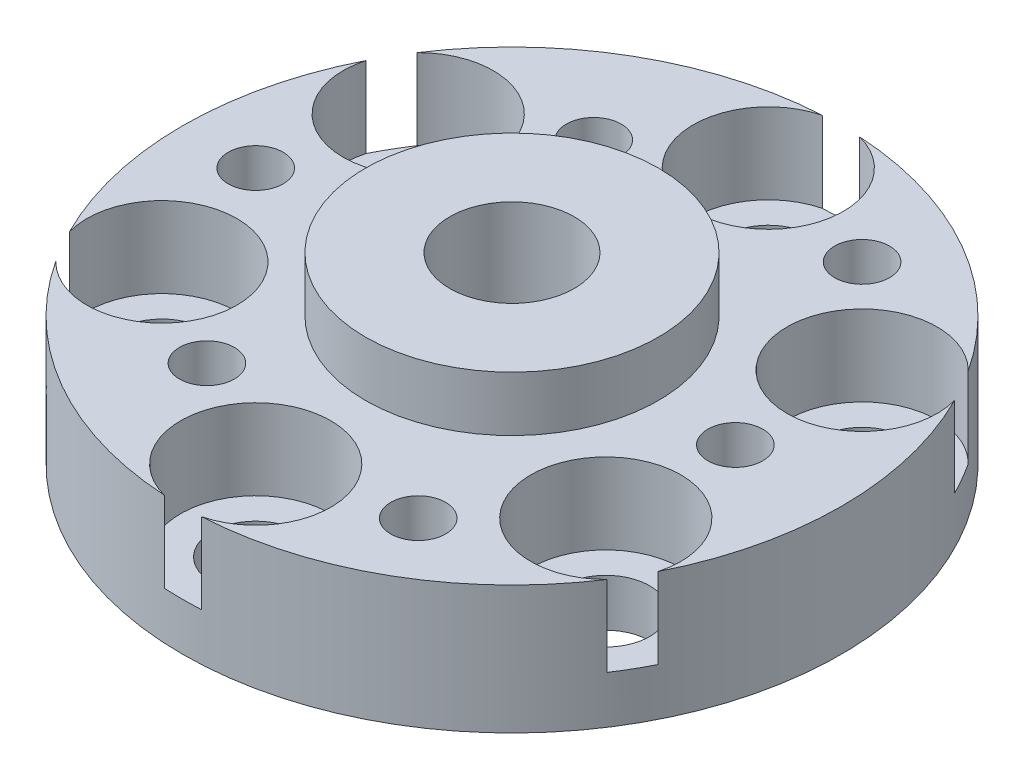
ISO-10303-21;
HEADER;
FILE_DESCRIPTION(('STEP AP214'),'2;1');
FILE_NAME('part.step','',(''),(''),'','','');
FILE_SCHEMA(('AUTOMOTIVE_DESIGN { 1 0 10303 214 1 1 1 1 }'));
ENDSEC;
DATA;
#1=APPLICATION_CONTEXT('core data for automotive mechanical design processes');
#2=APPLICATION_PROTOCOL_DEFINITION('international standard','automotive_design',2000,#1);
#3=PRODUCT_CONTEXT('',#1,'mechanical');
#4=PRODUCT('Part','Part','',(#3));
#5=PRODUCT_RELATED_PRODUCT_CATEGORY('part','',(#4));
#6=PRODUCT_DEFINITION_FORMATION('','',#4);
#7=PRODUCT_DEFINITION_CONTEXT('part definition',#1,'design');
#8=PRODUCT_DEFINITION('design','',#6,#7);
#9=PRODUCT_DEFINITION_SHAPE('','',#8);
#10=(LENGTH_UNIT() NAMED_UNIT(*) SI_UNIT(.MILLI.,.METRE.));
#11=(NAMED_UNIT(*) PLANE_ANGLE_UNIT() SI_UNIT($,.RADIAN.));
#12=(NAMED_UNIT(*) SI_UNIT($,.STERADIAN.) SOLID_ANGLE_UNIT());
#13=UNCERTAINTY_MEASURE_WITH_UNIT(LENGTH_MEASURE(1.E-05),#10,'distance_accuracy_value','');
#14=(GEOMETRIC_REPRESENTATION_CONTEXT(3) GLOBAL_UNCERTAINTY_ASSIGNED_CONTEXT((#13)) GLOBAL_UNIT_ASSIGNED_CONTEXT((#10,
#11,#12)) REPRESENTATION_CONTEXT('',''));
#15=CARTESIAN_POINT('',(0.,0.,0.));
#16=DIRECTION('',(0.,0.,1.));
#17=DIRECTION('',(1.,0.,0.));
#18=AXIS2_PLACEMENT_3D('',#15,#16,#17);
#19=CARTESIAN_POINT('',(0.,7.,0.));
#20=DIRECTION('',(0.,-1.,0.));
#21=DIRECTION('',(0.,0.,-1.));
#22=AXIS2_PLACEMENT_3D('',#19,#20,#21);
#23=CYLINDRICAL_SURFACE('',#22,18.);
#24=CARTESIAN_POINT('',(0.,2.6,0.));
#25=DIRECTION('',(0.,-1.,0.));
#26=DIRECTION('',(0.,0.,-1.));
#27=AXIS2_PLACEMENT_3D('',#24,#25,#26);
#28=CIRCLE('',#27,18.);
#29=CARTESIAN_POINT('',(-1.02009397076136,2.6,-17.9710714285714));
#30=VERTEX_POINT('',#29);
#31=CARTESIAN_POINT('',(1.02009397076136,2.6,-17.9710714285714));
#32=VERTEX_POINT('',#31);
#33=EDGE_CURVE('E11',#30,#32,#28,.T.);
#34=ORIENTED_EDGE('',*,*,#33,.T.);
#35=DIRECTION('',(0.,1.,0.));
#36=VECTOR('',#35,1.);
#37=CARTESIAN_POINT('',(1.02009397076138,4.8,-17.9710714285714));
#38=LINE('',#37,#36);
#39=CARTESIAN_POINT('',(1.02009397076138,7.,-17.9710714285714));
#40=VERTEX_POINT('',#39);
#41=EDGE_CURVE('E133',#32,#40,#38,.T.);
#42=ORIENTED_EDGE('',*,*,#41,.T.);
#43=CARTESIAN_POINT('',(0.,7.,0.));
#44=DIRECTION('',(0.,1.,0.));
#45=DIRECTION('',(0.,0.,1.));
#46=AXIS2_PLACEMENT_3D('',#43,#44,#45);
#47=CIRCLE('',#46,18.);
#48=CARTESIAN_POINT('',(15.0533574049853,7.,-9.86896300721486));
#49=VERTEX_POINT('',#48);
#50=EDGE_CURVE('E399',#49,#40,#47,.T.);
#51=ORIENTED_EDGE('',*,*,#50,.F.);
#52=DIRECTION('',(0.,1.,0.));
#53=VECTOR('',#52,1.);
#54=CARTESIAN_POINT('',(15.0533574049853,4.8,-9.86896300721486));
#55=LINE('',#54,#53);
#56=CARTESIAN_POINT('',(15.0533574049853,2.6,-9.86896300721487));
#57=VERTEX_POINT('',#56);
#58=EDGE_CURVE('E290',#49,#57,#55,.F.);
#59=ORIENTED_EDGE('',*,*,#58,.T.);
#60=CARTESIAN_POINT('',(0.,2.6,0.));
#61=DIRECTION('',(0.,-1.,0.));
#62=DIRECTION('',(0.,0.,-1.));
#63=AXIS2_PLACEMENT_3D('',#60,#61,#62);
#64=CIRCLE('',#63,18.);
#65=CARTESIAN_POINT('',(16.0734513757492,2.6,-8.10210842135708));
#66=VERTEX_POINT('',#65);
#67=EDGE_CURVE('E286',#57,#66,#64,.T.);
#68=ORIENTED_EDGE('',*,*,#67,.T.);
#69=DIRECTION('',(0.,1.,0.));
#70=VECTOR('',#69,1.);
#71=CARTESIAN_POINT('',(16.0734513757492,4.8,-8.10210842135708));
#72=LINE('',#71,#70);
#73=CARTESIAN_POINT('',(16.0734513757492,7.,-8.10210842135708));
#74=VERTEX_POINT('',#73);
#75=EDGE_CURVE('E294',#66,#74,#72,.T.);
#76=ORIENTED_EDGE('',*,*,#75,.T.);
#77=CARTESIAN_POINT('',(16.0734513757499,7.,8.10210842135571));
#78=VERTEX_POINT('',#77);
#79=EDGE_CURVE('E402',#78,#74,#47,.T.);
#80=ORIENTED_EDGE('',*,*,#79,.F.);
#81=DIRECTION('',(0.,1.,0.));
#82=VECTOR('',#81,1.);
#83=CARTESIAN_POINT('',(16.0734513757499,4.8,8.10210842135571));
#84=LINE('',#83,#82);
#85=CARTESIAN_POINT('',(16.0734513757499,2.6,8.10210842135571));
#86=VERTEX_POINT('',#85);
#87=EDGE_CURVE('E178',#78,#86,#84,.F.);
#88=ORIENTED_EDGE('',*,*,#87,.T.);
#89=CARTESIAN_POINT('',(0.,2.6,0.));
#90=DIRECTION('',(0.,-1.,0.));
#91=DIRECTION('',(0.,0.,-1.));
#92=AXIS2_PLACEMENT_3D('',#89,#90,#91);
#93=CIRCLE('',#92,18.);
#94=CARTESIAN_POINT('',(15.0533574049861,2.6,9.86896300721358));
#95=VERTEX_POINT('',#94);
#96=EDGE_CURVE('E282',#86,#95,#93,.T.);
#97=ORIENTED_EDGE('',*,*,#96,.T.);
#98=DIRECTION('',(0.,1.,0.));
#99=VECTOR('',#98,1.);
#100=CARTESIAN_POINT('',(15.0533574049861,4.8,9.86896300721358));
#101=LINE('',#100,#99);
#102=CARTESIAN_POINT('',(15.0533574049861,7.,9.86896300721358));
#103=VERTEX_POINT('',#102);
#104=EDGE_CURVE('E182',#95,#103,#101,.T.);
#105=ORIENTED_EDGE('',*,*,#104,.T.);
#106=CARTESIAN_POINT('',(1.0200939707629,7.,17.9710714285713));
#107=VERTEX_POINT('',#106);
#108=EDGE_CURVE('E406',#107,#103,#47,.T.);
#109=ORIENTED_EDGE('',*,*,#108,.F.);
#110=DIRECTION('',(0.,1.,0.));
#111=VECTOR('',#110,1.);
#112=CARTESIAN_POINT('',(1.0200939707629,4.8,17.9710714285713));
#113=LINE('',#112,#111);
#114=CARTESIAN_POINT('',(1.0200939707629,2.6,17.9710714285713));
#115=VERTEX_POINT('',#114);
#116=EDGE_CURVE('E197',#107,#115,#113,.F.);
#117=ORIENTED_EDGE('',*,*,#116,.T.);
#118=CARTESIAN_POINT('',(0.,2.6,0.));
#119=DIRECTION('',(0.,-1.,0.));
#120=DIRECTION('',(0.,0.,-1.));
#121=AXIS2_PLACEMENT_3D('',#118,#119,#120);
#122=CIRCLE('',#121,18.);
#123=CARTESIAN_POINT('',(-1.02009397075985,2.6,17.9710714285715));
#124=VERTEX_POINT('',#123);
#125=EDGE_CURVE('E269',#115,#124,#122,.T.);
#126=ORIENTED_EDGE('',*,*,#125,.T.);
#127=DIRECTION('',(0.,1.,0.));
#128=VECTOR('',#127,1.);
#129=CARTESIAN_POINT('',(-1.02009397075985,4.8,17.9710714285715));
#130=LINE('',#129,#128);
#131=CARTESIAN_POINT('',(-1.02009397075985,7.,17.9710714285715));
#132=VERTEX_POINT('',#131);
#133=EDGE_CURVE('E201',#124,#132,#130,.T.);
#134=ORIENTED_EDGE('',*,*,#133,.T.);
#135=CARTESIAN_POINT('',(-15.0533574049877,7.,9.86896300721121));
#136=VERTEX_POINT('',#135);
#137=EDGE_CURVE('E249',#136,#132,#47,.T.);
#138=ORIENTED_EDGE('',*,*,#137,.F.);
#139=DIRECTION('',(0.,1.,0.));
#140=VECTOR('',#139,1.);
#141=CARTESIAN_POINT('',(-15.0533574049877,4.8,9.86896300721121));
#142=LINE('',#141,#140);
#143=CARTESIAN_POINT('',(-15.0533574049877,2.6,9.86896300721121));
#144=VERTEX_POINT('',#143);
#145=EDGE_CURVE('E220',#136,#144,#142,.F.);
#146=ORIENTED_EDGE('',*,*,#145,.T.);
#147=CARTESIAN_POINT('',(0.,2.6,0.));
#148=DIRECTION('',(0.,-1.,0.));
#149=DIRECTION('',(0.,0.,-1.));
#150=AXIS2_PLACEMENT_3D('',#147,#148,#149);
#151=CIRCLE('',#150,18.);
#152=CARTESIAN_POINT('',(-16.0734513757466,2.6,8.10210842136235));
#153=VERTEX_POINT('',#152);
#154=EDGE_CURVE('E209',#144,#153,#151,.T.);
#155=ORIENTED_EDGE('',*,*,#154,.T.);
#156=DIRECTION('',(0.,1.,0.));
#157=VECTOR('',#156,1.);
#158=CARTESIAN_POINT('',(-16.0734513757466,4.8,8.10210842136235));
#159=LINE('',#158,#157);
#160=CARTESIAN_POINT('',(-16.0734513757466,7.,8.10210842136235));
#161=VERTEX_POINT('',#160);
#162=EDGE_CURVE('E224',#153,#161,#159,.T.);
#163=ORIENTED_EDGE('',*,*,#162,.T.);
#164=CARTESIAN_POINT('',(-16.0734513757473,7.,-8.10210842136098));
#165=VERTEX_POINT('',#164);
#166=EDGE_CURVE('E244',#165,#161,#47,.T.);
#167=ORIENTED_EDGE('',*,*,#166,.F.);
#168=DIRECTION('',(0.,1.,0.));
#169=VECTOR('',#168,1.);
#170=CARTESIAN_POINT('',(-16.0734513757473,4.8,-8.10210842136098));
#171=LINE('',#170,#169);
#172=CARTESIAN_POINT('',(-16.0734513757473,2.6,-8.10210842136098));
#173=VERTEX_POINT('',#172);
#174=EDGE_CURVE('E236',#165,#173,#171,.F.);
#175=ORIENTED_EDGE('',*,*,#174,.T.);
#176=CARTESIAN_POINT('',(0.,2.6,0.));
#177=DIRECTION('',(0.,-1.,0.));
#178=DIRECTION('',(0.,0.,-1.));
#179=AXIS2_PLACEMENT_3D('',#176,#177,#178);
#180=CIRCLE('',#179,18.);
#181=CARTESIAN_POINT('',(-15.0533574049885,2.6,-9.86896300720993));
#182=VERTEX_POINT('',#181);
#183=EDGE_CURVE('E210',#173,#182,#180,.T.);
#184=ORIENTED_EDGE('',*,*,#183,.T.);
#185=DIRECTION('',(0.,1.,0.));
#186=VECTOR('',#185,1.);
#187=CARTESIAN_POINT('',(-15.0533574049885,4.8,-9.86896300720993));
#188=LINE('',#187,#186);
#189=CARTESIAN_POINT('',(-15.0533574049885,7.,-9.86896300720993));
#190=VERTEX_POINT('',#189);
#191=EDGE_CURVE('E240',#182,#190,#188,.T.);
#192=ORIENTED_EDGE('',*,*,#191,.T.);
#193=CARTESIAN_POINT('',(-1.02009397076138,7.,-17.9710714285714));
#194=VERTEX_POINT('',#193);
#195=EDGE_CURVE('E152',#194,#190,#47,.T.);
#196=ORIENTED_EDGE('',*,*,#195,.F.);
#197=DIRECTION('',(0.,1.,0.));
#198=VECTOR('',#197,1.);
#199=CARTESIAN_POINT('',(-1.02009397076138,4.8,-17.9710714285714));
#200=LINE('',#199,#198);
#201=EDGE_CURVE('E60',#194,#30,#200,.F.);
#202=ORIENTED_EDGE('',*,*,#201,.T.);
#203=EDGE_LOOP('',(#34,#42,#51,#59,#68,#76,#80,#88,#97,#105,#109,#117,#126,#134,#138,#146,#155,
#163,#167,#175,#184,#192,#196,#202));
#204=FACE_BOUND('',#203,.T.);
#205=CARTESIAN_POINT('',(0.,0.,0.));
#206=DIRECTION('',(0.,1.,0.));
#207=DIRECTION('',(0.,0.,1.));
#208=AXIS2_PLACEMENT_3D('',#205,#206,#207);
#209=CIRCLE('',#208,18.);
#210=CARTESIAN_POINT('',(0.,0.,18.));
#211=VERTEX_POINT('',#210);
#212=EDGE_CURVE('E250',#211,#211,#209,.T.);
#213=ORIENTED_EDGE('',*,*,#212,.T.);
#214=EDGE_LOOP('',(#213));
#215=FACE_BOUND('',#214,.T.);
#216=ADVANCED_FACE('F45',(#204,#215),#23,.T.);
#217=CARTESIAN_POINT('',(0.,7.,0.));
#218=DIRECTION('',(0.,1.,0.));
#219=DIRECTION('',(0.,0.,1.));
#220=AXIS2_PLACEMENT_3D('',#217,#218,#219);
#221=PLANE('',#220);
#222=CARTESIAN_POINT('',(0.,7.,0.));
#223=DIRECTION('',(0.,1.,0.));
#224=DIRECTION('',(0.,0.,1.));
#225=AXIS2_PLACEMENT_3D('',#222,#223,#224);
#226=CIRCLE('',#225,8.);
#227=CARTESIAN_POINT('',(0.,7.,8.));
#228=VERTEX_POINT('',#227);
#229=EDGE_CURVE('E550',#228,#228,#226,.T.);
#230=ORIENTED_EDGE('',*,*,#229,.F.);
#231=EDGE_LOOP('',(#230));
#232=FACE_BOUND('',#231,.T.);
#233=CARTESIAN_POINT('',(12.2,7.,0.));
#234=DIRECTION('',(0.,1.,0.));
#235=DIRECTION('',(0.,0.,1.));
#236=AXIS2_PLACEMENT_3D('',#233,#234,#235);
#237=CIRCLE('',#236,1.49999999999999);
#238=CARTESIAN_POINT('',(12.2,7.,1.49999999999999));
#239=VERTEX_POINT('',#238);
#240=EDGE_CURVE('E557',#239,#239,#237,.T.);
#241=ORIENTED_EDGE('',*,*,#240,.F.);
#242=EDGE_LOOP('',(#241));
#243=FACE_BOUND('',#242,.T.);
#244=CARTESIAN_POINT('',(-6.10000000000005,7.,10.5655099261701));
#245=DIRECTION('',(0.,1.,0.));
#246=DIRECTION('',(0.,0.,1.));
#247=AXIS2_PLACEMENT_3D('',#244,#245,#246);
#248=CIRCLE('',#247,1.49999999999999);
#249=CARTESIAN_POINT('',(-6.10000000000005,7.,12.0655099261701));
#250=VERTEX_POINT('',#249);
#251=EDGE_CURVE('E568',#250,#250,#248,.T.);
#252=ORIENTED_EDGE('',*,*,#251,.F.);
#253=EDGE_LOOP('',(#252));
#254=FACE_BOUND('',#253,.T.);
#255=CARTESIAN_POINT('',(-6.0999999999999,7.,-10.5655099261702));
#256=DIRECTION('',(0.,1.,0.));
#257=DIRECTION('',(0.,0.,1.));
#258=AXIS2_PLACEMENT_3D('',#255,#256,#257);
#259=CIRCLE('',#258,1.49999999999999);
#260=CARTESIAN_POINT('',(-6.0999999999999,7.,-9.06550992617022));
#261=VERTEX_POINT('',#260);
#262=EDGE_CURVE('E576',#261,#261,#259,.T.);
#263=ORIENTED_EDGE('',*,*,#262,.F.);
#264=EDGE_LOOP('',(#263));
#265=FACE_BOUND('',#264,.T.);
#266=CARTESIAN_POINT('',(-14.,7.,0.));
#267=DIRECTION('',(0.,1.,0.));
#268=DIRECTION('',(0.,0.,1.));
#269=AXIS2_PLACEMENT_3D('',#266,#267,#268);
#270=CIRCLE('',#269,1.5);
#271=CARTESIAN_POINT('',(-14.,7.,1.5));
#272=VERTEX_POINT('',#271);
#273=EDGE_CURVE('E584',#272,#272,#270,.T.);
#274=ORIENTED_EDGE('',*,*,#273,.F.);
#275=EDGE_LOOP('',(#274));
#276=FACE_BOUND('',#275,.T.);
#277=CARTESIAN_POINT('',(7.00000000000023,7.,-12.124355652982));
#278=DIRECTION('',(0.,1.,0.));
#279=DIRECTION('',(0.,0.,1.));
#280=AXIS2_PLACEMENT_3D('',#277,#278,#279);
#281=CIRCLE('',#280,1.5);
#282=CARTESIAN_POINT('',(7.00000000000023,7.,-10.624355652982));
#283=VERTEX_POINT('',#282);
#284=EDGE_CURVE('E592',#283,#283,#281,.T.);
#285=ORIENTED_EDGE('',*,*,#284,.F.);
#286=EDGE_LOOP('',(#285));
#287=FACE_BOUND('',#286,.T.);
#288=CARTESIAN_POINT('',(7.,7.,12.1243556529821));
#289=DIRECTION('',(0.,1.,0.));
#290=DIRECTION('',(0.,0.,1.));
#291=AXIS2_PLACEMENT_3D('',#288,#289,#290);
#292=CIRCLE('',#291,1.5);
#293=CARTESIAN_POINT('',(7.,7.,13.6243556529821));
#294=VERTEX_POINT('',#293);
#295=EDGE_CURVE('E600',#294,#294,#292,.T.);
#296=ORIENTED_EDGE('',*,*,#295,.F.);
#297=EDGE_LOOP('',(#296));
#298=FACE_BOUND('',#297,.T.);
#299=CARTESIAN_POINT('',(0.,7.,-14.));
#300=DIRECTION('',(0.,1.,0.));
#301=DIRECTION('',(0.,0.,1.));
#302=AXIS2_PLACEMENT_3D('',#299,#300,#301);
#303=CIRCLE('',#302,4.1);
#304=EDGE_CURVE('E53',#194,#40,#303,.T.);
#305=ORIENTED_EDGE('',*,*,#304,.F.);
#306=ORIENTED_EDGE('',*,*,#195,.T.);
#307=CARTESIAN_POINT('',(-12.1243556529818,7.,-6.99999999999949));
#308=DIRECTION('',(0.,1.,0.));
#309=DIRECTION('',(0.,0.,1.));
#310=AXIS2_PLACEMENT_3D('',#307,#308,#309);
#311=CIRCLE('',#310,4.1);
#312=EDGE_CURVE('E248',#165,#190,#311,.T.);
#313=ORIENTED_EDGE('',*,*,#312,.F.);
#314=ORIENTED_EDGE('',*,*,#166,.T.);
#315=CARTESIAN_POINT('',(-12.1243556529812,7.,7.00000000000052));
#316=DIRECTION('',(0.,1.,0.));
#317=DIRECTION('',(0.,0.,1.));
#318=AXIS2_PLACEMENT_3D('',#315,#316,#317);
#319=CIRCLE('',#318,4.1);
#320=EDGE_CURVE('E206',#136,#161,#319,.T.);
#321=ORIENTED_EDGE('',*,*,#320,.F.);
#322=ORIENTED_EDGE('',*,*,#137,.T.);
#323=CARTESIAN_POINT('',(1.18856827952055E-12,7.,14.));
#324=DIRECTION('',(0.,1.,0.));
#325=DIRECTION('',(0.,0.,1.));
#326=AXIS2_PLACEMENT_3D('',#323,#324,#325);
#327=CIRCLE('',#326,4.1);
#328=EDGE_CURVE('E186',#107,#132,#327,.T.);
#329=ORIENTED_EDGE('',*,*,#328,.F.);
#330=ORIENTED_EDGE('',*,*,#108,.T.);
#331=CARTESIAN_POINT('',(12.124355652983,7.,6.99999999999948));
#332=DIRECTION('',(0.,1.,0.));
#333=DIRECTION('',(0.,0.,1.));
#334=AXIS2_PLACEMENT_3D('',#331,#332,#333);
#335=CIRCLE('',#334,4.1);
#336=EDGE_CURVE('E273',#78,#103,#335,.T.);
#337=ORIENTED_EDGE('',*,*,#336,.F.);
#338=ORIENTED_EDGE('',*,*,#79,.T.);
#339=CARTESIAN_POINT('',(12.1243556529824,7.,-7.00000000000052));
#340=DIRECTION('',(0.,1.,0.));
#341=DIRECTION('',(0.,0.,1.));
#342=AXIS2_PLACEMENT_3D('',#339,#340,#341);
#343=CIRCLE('',#342,4.1);
#344=EDGE_CURVE('E159',#49,#74,#343,.T.);
#345=ORIENTED_EDGE('',*,*,#344,.F.);
#346=ORIENTED_EDGE('',*,*,#50,.T.);
#347=EDGE_LOOP('',(#305,#306,#313,#314,#321,#322,#329,#330,#337,#338,#345,#346));
#348=FACE_BOUND('',#347,.T.);
#349=ADVANCED_FACE('F324',(#232,#243,#254,#265,#276,#287,#298,#348),#221,.T.);
#350=CARTESIAN_POINT('',(0.,0.,0.));
#351=DIRECTION('',(0.,1.,0.));
#352=DIRECTION('',(0.,0.,1.));
#353=AXIS2_PLACEMENT_3D('',#350,#351,#352);
#354=PLANE('',#353);
#355=CARTESIAN_POINT('',(0.,0.,0.));
#356=DIRECTION('',(0.,1.,0.));
#357=DIRECTION('',(0.,0.,1.));
#358=AXIS2_PLACEMENT_3D('',#355,#356,#357);
#359=CIRCLE('',#358,3.4);
#360=CARTESIAN_POINT('',(0.,0.,3.4));
#361=VERTEX_POINT('',#360);
#362=EDGE_CURVE('E543',#361,#361,#359,.T.);
#363=ORIENTED_EDGE('',*,*,#362,.T.);
#364=EDGE_LOOP('',(#363));
#365=FACE_BOUND('',#364,.T.);
#366=CARTESIAN_POINT('',(12.2,0.,0.));
#367=DIRECTION('',(0.,1.,0.));
#368=DIRECTION('',(0.,0.,1.));
#369=AXIS2_PLACEMENT_3D('',#366,#367,#368);
#370=CIRCLE('',#369,1.49999999999999);
#371=CARTESIAN_POINT('',(12.2,0.,1.49999999999999));
#372=VERTEX_POINT('',#371);
#373=EDGE_CURVE('E564',#372,#372,#370,.T.);
#374=ORIENTED_EDGE('',*,*,#373,.T.);
#375=EDGE_LOOP('',(#374));
#376=FACE_BOUND('',#375,.T.);
#377=CARTESIAN_POINT('',(-6.10000000000005,0.,10.5655099261701));
#378=DIRECTION('',(0.,1.,0.));
#379=DIRECTION('',(0.,0.,1.));
#380=AXIS2_PLACEMENT_3D('',#377,#378,#379);
#381=CIRCLE('',#380,1.49999999999999);
#382=CARTESIAN_POINT('',(-6.10000000000005,0.,12.0655099261701));
#383=VERTEX_POINT('',#382);
#384=EDGE_CURVE('E572',#383,#383,#381,.T.);
#385=ORIENTED_EDGE('',*,*,#384,.T.);
#386=EDGE_LOOP('',(#385));
#387=FACE_BOUND('',#386,.T.);
#388=CARTESIAN_POINT('',(-6.0999999999999,0.,-10.5655099261702));
#389=DIRECTION('',(0.,1.,0.));
#390=DIRECTION('',(0.,0.,1.));
#391=AXIS2_PLACEMENT_3D('',#388,#389,#390);
#392=CIRCLE('',#391,1.49999999999999);
#393=CARTESIAN_POINT('',(-6.0999999999999,0.,-9.06550992617022));
#394=VERTEX_POINT('',#393);
#395=EDGE_CURVE('E580',#394,#394,#392,.T.);
#396=ORIENTED_EDGE('',*,*,#395,.T.);
#397=EDGE_LOOP('',(#396));
#398=FACE_BOUND('',#397,.T.);
#399=CARTESIAN_POINT('',(-14.,0.,0.));
#400=DIRECTION('',(0.,1.,0.));
#401=DIRECTION('',(0.,0.,1.));
#402=AXIS2_PLACEMENT_3D('',#399,#400,#401);
#403=CIRCLE('',#402,1.5);
#404=CARTESIAN_POINT('',(-14.,0.,1.5));
#405=VERTEX_POINT('',#404);
#406=EDGE_CURVE('E588',#405,#405,#403,.T.);
#407=ORIENTED_EDGE('',*,*,#406,.T.);
#408=EDGE_LOOP('',(#407));
#409=FACE_BOUND('',#408,.T.);
#410=CARTESIAN_POINT('',(7.00000000000023,0.,-12.124355652982));
#411=DIRECTION('',(0.,1.,0.));
#412=DIRECTION('',(0.,0.,1.));
#413=AXIS2_PLACEMENT_3D('',#410,#411,#412);
#414=CIRCLE('',#413,1.5);
#415=CARTESIAN_POINT('',(7.00000000000023,0.,-10.624355652982));
#416=VERTEX_POINT('',#415);
#417=EDGE_CURVE('E596',#416,#416,#414,.T.);
#418=ORIENTED_EDGE('',*,*,#417,.T.);
#419=EDGE_LOOP('',(#418));
#420=FACE_BOUND('',#419,.T.);
#421=CARTESIAN_POINT('',(7.,0.,12.1243556529821));
#422=DIRECTION('',(0.,1.,0.));
#423=DIRECTION('',(0.,0.,1.));
#424=AXIS2_PLACEMENT_3D('',#421,#422,#423);
#425=CIRCLE('',#424,1.5);
#426=CARTESIAN_POINT('',(7.,0.,13.6243556529821));
#427=VERTEX_POINT('',#426);
#428=EDGE_CURVE('E147',#427,#427,#425,.T.);
#429=ORIENTED_EDGE('',*,*,#428,.T.);
#430=EDGE_LOOP('',(#429));
#431=FACE_BOUND('',#430,.T.);
#432=CARTESIAN_POINT('',(0.,0.,-14.));
#433=DIRECTION('',(0.,1.,0.));
#434=DIRECTION('',(0.,0.,1.));
#435=AXIS2_PLACEMENT_3D('',#432,#433,#434);
#436=CIRCLE('',#435,2.4);
#437=CARTESIAN_POINT('',(0.,0.,-11.6));
#438=VERTEX_POINT('',#437);
#439=EDGE_CURVE('E141',#438,#438,#436,.T.);
#440=ORIENTED_EDGE('',*,*,#439,.T.);
#441=EDGE_LOOP('',(#440));
#442=FACE_BOUND('',#441,.T.);
#443=CARTESIAN_POINT('',(12.1243556529824,0.,-7.00000000000052));
#444=DIRECTION('',(0.,1.,0.));
#445=DIRECTION('',(0.,0.,1.));
#446=AXIS2_PLACEMENT_3D('',#443,#444,#445);
#447=CIRCLE('',#446,2.4);
#448=CARTESIAN_POINT('',(12.1243556529824,0.,-4.60000000000052));
#449=VERTEX_POINT('',#448);
#450=EDGE_CURVE('E168',#449,#449,#447,.T.);
#451=ORIENTED_EDGE('',*,*,#450,.T.);
#452=EDGE_LOOP('',(#451));
#453=FACE_BOUND('',#452,.T.);
#454=CARTESIAN_POINT('',(12.124355652983,0.,6.99999999999948));
#455=DIRECTION('',(0.,1.,0.));
#456=DIRECTION('',(0.,0.,1.));
#457=AXIS2_PLACEMENT_3D('',#454,#455,#456);
#458=CIRCLE('',#457,2.4);
#459=CARTESIAN_POINT('',(12.124355652983,0.,9.39999999999948));
#460=VERTEX_POINT('',#459);
#461=EDGE_CURVE('E177',#460,#460,#458,.T.);
#462=ORIENTED_EDGE('',*,*,#461,.T.);
#463=EDGE_LOOP('',(#462));
#464=FACE_BOUND('',#463,.T.);
#465=CARTESIAN_POINT('',(1.18856827952055E-12,0.,14.));
#466=DIRECTION('',(0.,1.,0.));
#467=DIRECTION('',(0.,0.,1.));
#468=AXIS2_PLACEMENT_3D('',#465,#466,#467);
#469=CIRCLE('',#468,2.4);
#470=CARTESIAN_POINT('',(1.18856827952055E-12,0.,16.4));
#471=VERTEX_POINT('',#470);
#472=EDGE_CURVE('E205',#471,#471,#469,.T.);
#473=ORIENTED_EDGE('',*,*,#472,.T.);
#474=EDGE_LOOP('',(#473));
#475=FACE_BOUND('',#474,.T.);
#476=CARTESIAN_POINT('',(-12.1243556529812,0.,7.00000000000052));
#477=DIRECTION('',(0.,1.,0.));
#478=DIRECTION('',(0.,0.,1.));
#479=AXIS2_PLACEMENT_3D('',#476,#477,#478);
#480=CIRCLE('',#479,2.4);
#481=CARTESIAN_POINT('',(-12.1243556529812,0.,9.40000000000052));
#482=VERTEX_POINT('',#481);
#483=EDGE_CURVE('E219',#482,#482,#480,.T.);
#484=ORIENTED_EDGE('',*,*,#483,.T.);
#485=EDGE_LOOP('',(#484));
#486=FACE_BOUND('',#485,.T.);
#487=CARTESIAN_POINT('',(-12.1243556529818,0.,-6.99999999999949));
#488=DIRECTION('',(0.,1.,0.));
#489=DIRECTION('',(0.,0.,1.));
#490=AXIS2_PLACEMENT_3D('',#487,#488,#489);
#491=CIRCLE('',#490,2.4);
#492=CARTESIAN_POINT('',(-12.1243556529818,0.,-4.59999999999949));
#493=VERTEX_POINT('',#492);
#494=EDGE_CURVE('E243',#493,#493,#491,.T.);
#495=ORIENTED_EDGE('',*,*,#494,.T.);
#496=EDGE_LOOP('',(#495));
#497=FACE_BOUND('',#496,.T.);
#498=ORIENTED_EDGE('',*,*,#212,.F.);
#499=EDGE_LOOP('',(#498));
#500=FACE_BOUND('',#499,.T.);
#501=ADVANCED_FACE('F306',(#365,#376,#387,#398,#409,#420,#431,#442,#453,#464,#475,#486,#497,
#500),#354,.F.);
#502=CARTESIAN_POINT('',(-9.72435565298185,2.6,-6.99999999999949));
#503=DIRECTION('',(0.,-1.,0.));
#504=DIRECTION('',(0.,0.,-1.));
#505=AXIS2_PLACEMENT_3D('',#502,#503,#504);
#506=PLANE('',#505);
#507=CARTESIAN_POINT('',(-12.1243556529818,2.6,-6.99999999999949));
#508=DIRECTION('',(0.,1.,0.));
#509=DIRECTION('',(0.,0.,1.));
#510=AXIS2_PLACEMENT_3D('',#507,#508,#509);
#511=CIRCLE('',#510,2.4);
#512=CARTESIAN_POINT('',(-12.1243556529818,2.6,-4.59999999999949));
#513=VERTEX_POINT('',#512);
#514=EDGE_CURVE('E232',#513,#513,#511,.T.);
#515=ORIENTED_EDGE('',*,*,#514,.F.);
#516=EDGE_LOOP('',(#515));
#517=FACE_BOUND('',#516,.T.);
#518=CARTESIAN_POINT('',(-12.1243556529818,2.6,-6.99999999999949));
#519=DIRECTION('',(0.,1.,0.));
#520=DIRECTION('',(0.,0.,1.));
#521=AXIS2_PLACEMENT_3D('',#518,#519,#520);
#522=CIRCLE('',#521,4.1);
#523=EDGE_CURVE('E228',#173,#182,#522,.T.);
#524=ORIENTED_EDGE('',*,*,#523,.T.);
#525=ORIENTED_EDGE('',*,*,#183,.F.);
#526=EDGE_LOOP('',(#524,#525));
#527=FACE_BOUND('',#526,.T.);
#528=ADVANCED_FACE('F336',(#517,#527),#506,.F.);
#529=CARTESIAN_POINT('',(-12.1243556529818,7.,-6.99999999999949));
#530=DIRECTION('',(0.,1.,0.));
#531=DIRECTION('',(0.,0.,1.));
#532=AXIS2_PLACEMENT_3D('',#529,#530,#531);
#533=CYLINDRICAL_SURFACE('',#532,2.4);
#534=ORIENTED_EDGE('',*,*,#514,.T.);
#535=EDGE_LOOP('',(#534));
#536=FACE_BOUND('',#535,.T.);
#537=ORIENTED_EDGE('',*,*,#494,.F.);
#538=EDGE_LOOP('',(#537));
#539=FACE_BOUND('',#538,.T.);
#540=ADVANCED_FACE('F341',(#536,#539),#533,.F.);
#541=CARTESIAN_POINT('',(-12.1243556529818,7.,-6.99999999999949));
#542=DIRECTION('',(0.,1.,0.));
#543=DIRECTION('',(0.,0.,1.));
#544=AXIS2_PLACEMENT_3D('',#541,#542,#543);
#545=CYLINDRICAL_SURFACE('',#544,4.1);
#546=ORIENTED_EDGE('',*,*,#523,.F.);
#547=ORIENTED_EDGE('',*,*,#174,.F.);
#548=ORIENTED_EDGE('',*,*,#312,.T.);
#549=ORIENTED_EDGE('',*,*,#191,.F.);
#550=EDGE_LOOP('',(#546,#547,#548,#549));
#551=FACE_BOUND('',#550,.T.);
#552=ADVANCED_FACE('F344',(#551),#545,.F.);
#553=CARTESIAN_POINT('',(-9.72435565298125,2.6,7.00000000000052));
#554=DIRECTION('',(0.,-1.,0.));
#555=DIRECTION('',(0.,0.,-1.));
#556=AXIS2_PLACEMENT_3D('',#553,#554,#555);
#557=PLANE('',#556);
#558=CARTESIAN_POINT('',(-12.1243556529812,2.6,7.00000000000052));
#559=DIRECTION('',(0.,1.,0.));
#560=DIRECTION('',(0.,0.,1.));
#561=AXIS2_PLACEMENT_3D('',#558,#559,#560);
#562=CIRCLE('',#561,2.4);
#563=CARTESIAN_POINT('',(-12.1243556529812,2.6,9.40000000000052));
#564=VERTEX_POINT('',#563);
#565=EDGE_CURVE('E215',#564,#564,#562,.T.);
#566=ORIENTED_EDGE('',*,*,#565,.F.);
#567=EDGE_LOOP('',(#566));
#568=FACE_BOUND('',#567,.T.);
#569=CARTESIAN_POINT('',(-12.1243556529812,2.6,7.00000000000052));
#570=DIRECTION('',(0.,1.,0.));
#571=DIRECTION('',(0.,0.,1.));
#572=AXIS2_PLACEMENT_3D('',#569,#570,#571);
#573=CIRCLE('',#572,4.1);
#574=EDGE_CURVE('E211',#144,#153,#573,.T.);
#575=ORIENTED_EDGE('',*,*,#574,.T.);
#576=ORIENTED_EDGE('',*,*,#154,.F.);
#577=EDGE_LOOP('',(#575,#576));
#578=FACE_BOUND('',#577,.T.);
#579=ADVANCED_FACE('F350',(#568,#578),#557,.F.);
#580=CARTESIAN_POINT('',(-12.1243556529812,7.,7.00000000000052));
#581=DIRECTION('',(0.,1.,0.));
#582=DIRECTION('',(0.,0.,1.));
#583=AXIS2_PLACEMENT_3D('',#580,#581,#582);
#584=CYLINDRICAL_SURFACE('',#583,4.1);
#585=ORIENTED_EDGE('',*,*,#574,.F.);
#586=ORIENTED_EDGE('',*,*,#145,.F.);
#587=ORIENTED_EDGE('',*,*,#320,.T.);
#588=ORIENTED_EDGE('',*,*,#162,.F.);
#589=EDGE_LOOP('',(#585,#586,#587,#588));
#590=FACE_BOUND('',#589,.T.);
#591=ADVANCED_FACE('F356',(#590),#584,.F.);
#592=CARTESIAN_POINT('',(-12.1243556529812,7.,7.00000000000052));
#593=DIRECTION('',(0.,1.,0.));
#594=DIRECTION('',(0.,0.,1.));
#595=AXIS2_PLACEMENT_3D('',#592,#593,#594);
#596=CYLINDRICAL_SURFACE('',#595,2.4);
#597=ORIENTED_EDGE('',*,*,#565,.T.);
#598=EDGE_LOOP('',(#597));
#599=FACE_BOUND('',#598,.T.);
#600=ORIENTED_EDGE('',*,*,#483,.F.);
#601=EDGE_LOOP('',(#600));
#602=FACE_BOUND('',#601,.T.);
#603=ADVANCED_FACE('F352',(#599,#602),#596,.F.);
#604=CARTESIAN_POINT('',(2.40000000000119,2.6,14.));
#605=DIRECTION('',(0.,-1.,0.));
#606=DIRECTION('',(0.,0.,-1.));
#607=AXIS2_PLACEMENT_3D('',#604,#605,#606);
#608=PLANE('',#607);
#609=CARTESIAN_POINT('',(1.18856827952055E-12,2.6,14.));
#610=DIRECTION('',(0.,1.,0.));
#611=DIRECTION('',(0.,0.,1.));
#612=AXIS2_PLACEMENT_3D('',#609,#610,#611);
#613=CIRCLE('',#612,2.4);
#614=CARTESIAN_POINT('',(1.18856827952055E-12,2.6,16.4));
#615=VERTEX_POINT('',#614);
#616=EDGE_CURVE('E193',#615,#615,#613,.T.);
#617=ORIENTED_EDGE('',*,*,#616,.F.);
#618=EDGE_LOOP('',(#617));
#619=FACE_BOUND('',#618,.T.);
#620=CARTESIAN_POINT('',(1.18856827952055E-12,2.6,14.));
#621=DIRECTION('',(0.,1.,0.));
#622=DIRECTION('',(0.,0.,1.));
#623=AXIS2_PLACEMENT_3D('',#620,#621,#622);
#624=CIRCLE('',#623,4.1);
#625=EDGE_CURVE('E189',#115,#124,#624,.T.);
#626=ORIENTED_EDGE('',*,*,#625,.T.);
#627=ORIENTED_EDGE('',*,*,#125,.F.);
#628=EDGE_LOOP('',(#626,#627));
#629=FACE_BOUND('',#628,.T.);
#630=ADVANCED_FACE('F355',(#619,#629),#608,.F.);
#631=CARTESIAN_POINT('',(1.18856827952055E-12,7.,14.));
#632=DIRECTION('',(0.,1.,0.));
#633=DIRECTION('',(0.,0.,1.));
#634=AXIS2_PLACEMENT_3D('',#631,#632,#633);
#635=CYLINDRICAL_SURFACE('',#634,2.4);
#636=ORIENTED_EDGE('',*,*,#616,.T.);
#637=EDGE_LOOP('',(#636));
#638=FACE_BOUND('',#637,.T.);
#639=ORIENTED_EDGE('',*,*,#472,.F.);
#640=EDGE_LOOP('',(#639));
#641=FACE_BOUND('',#640,.T.);
#642=ADVANCED_FACE('F364',(#638,#641),#635,.F.);
#643=CARTESIAN_POINT('',(1.18856827952055E-12,7.,14.));
#644=DIRECTION('',(0.,1.,0.));
#645=DIRECTION('',(0.,0.,1.));
#646=AXIS2_PLACEMENT_3D('',#643,#644,#645);
#647=CYLINDRICAL_SURFACE('',#646,4.1);
#648=ORIENTED_EDGE('',*,*,#625,.F.);
#649=ORIENTED_EDGE('',*,*,#116,.F.);
#650=ORIENTED_EDGE('',*,*,#328,.T.);
#651=ORIENTED_EDGE('',*,*,#133,.F.);
#652=EDGE_LOOP('',(#648,#649,#650,#651));
#653=FACE_BOUND('',#652,.T.);
#654=ADVANCED_FACE('F367',(#653),#647,.F.);
#655=CARTESIAN_POINT('',(14.524355652983,2.6,6.99999999999948));
#656=DIRECTION('',(0.,-1.,0.));
#657=DIRECTION('',(0.,0.,-1.));
#658=AXIS2_PLACEMENT_3D('',#655,#656,#657);
#659=PLANE('',#658);
#660=CARTESIAN_POINT('',(12.124355652983,2.6,6.99999999999948));
#661=DIRECTION('',(0.,1.,0.));
#662=DIRECTION('',(0.,0.,1.));
#663=AXIS2_PLACEMENT_3D('',#660,#661,#662);
#664=CIRCLE('',#663,2.4);
#665=CARTESIAN_POINT('',(12.124355652983,2.6,9.39999999999948));
#666=VERTEX_POINT('',#665);
#667=EDGE_CURVE('E173',#666,#666,#664,.T.);
#668=ORIENTED_EDGE('',*,*,#667,.F.);
#669=EDGE_LOOP('',(#668));
#670=FACE_BOUND('',#669,.T.);
#671=CARTESIAN_POINT('',(12.124355652983,2.6,6.99999999999948));
#672=DIRECTION('',(0.,1.,0.));
#673=DIRECTION('',(0.,0.,1.));
#674=AXIS2_PLACEMENT_3D('',#671,#672,#673);
#675=CIRCLE('',#674,4.1);
#676=EDGE_CURVE('E169',#86,#95,#675,.T.);
#677=ORIENTED_EDGE('',*,*,#676,.T.);
#678=ORIENTED_EDGE('',*,*,#96,.F.);
#679=EDGE_LOOP('',(#677,#678));
#680=FACE_BOUND('',#679,.T.);
#681=ADVANCED_FACE('F374',(#670,#680),#659,.F.);
#682=CARTESIAN_POINT('',(12.124355652983,7.,6.99999999999948));
#683=DIRECTION('',(0.,1.,0.));
#684=DIRECTION('',(0.,0.,1.));
#685=AXIS2_PLACEMENT_3D('',#682,#683,#684);
#686=CYLINDRICAL_SURFACE('',#685,4.1);
#687=ORIENTED_EDGE('',*,*,#676,.F.);
#688=ORIENTED_EDGE('',*,*,#87,.F.);
#689=ORIENTED_EDGE('',*,*,#336,.T.);
#690=ORIENTED_EDGE('',*,*,#104,.F.);
#691=EDGE_LOOP('',(#687,#688,#689,#690));
#692=FACE_BOUND('',#691,.T.);
#693=ADVANCED_FACE('F380',(#692),#686,.F.);
#694=CARTESIAN_POINT('',(12.124355652983,7.,6.99999999999948));
#695=DIRECTION('',(0.,1.,0.));
#696=DIRECTION('',(0.,0.,1.));
#697=AXIS2_PLACEMENT_3D('',#694,#695,#696);
#698=CYLINDRICAL_SURFACE('',#697,2.4);
#699=ORIENTED_EDGE('',*,*,#667,.T.);
#700=EDGE_LOOP('',(#699));
#701=FACE_BOUND('',#700,.T.);
#702=ORIENTED_EDGE('',*,*,#461,.F.);
#703=EDGE_LOOP('',(#702));
#704=FACE_BOUND('',#703,.T.);
#705=ADVANCED_FACE('F376',(#701,#704),#698,.F.);
#706=CARTESIAN_POINT('',(12.1243556529824,7.,-7.00000000000052));
#707=DIRECTION('',(0.,1.,0.));
#708=DIRECTION('',(0.,0.,1.));
#709=AXIS2_PLACEMENT_3D('',#706,#707,#708);
#710=CYLINDRICAL_SURFACE('',#709,2.4);
#711=CARTESIAN_POINT('',(12.1243556529824,2.6,-7.00000000000052));
#712=DIRECTION('',(0.,1.,0.));
#713=DIRECTION('',(0.,0.,1.));
#714=AXIS2_PLACEMENT_3D('',#711,#712,#713);
#715=CIRCLE('',#714,2.4);
#716=CARTESIAN_POINT('',(12.1243556529824,2.6,-4.60000000000052));
#717=VERTEX_POINT('',#716);
#718=EDGE_CURVE('E164',#717,#717,#715,.T.);
#719=ORIENTED_EDGE('',*,*,#718,.T.);
#720=EDGE_LOOP('',(#719));
#721=FACE_BOUND('',#720,.T.);
#722=ORIENTED_EDGE('',*,*,#450,.F.);
#723=EDGE_LOOP('',(#722));
#724=FACE_BOUND('',#723,.T.);
#725=ADVANCED_FACE('F379',(#721,#724),#710,.F.);
#726=CARTESIAN_POINT('',(12.1243556529824,7.,-7.00000000000052));
#727=DIRECTION('',(0.,1.,0.));
#728=DIRECTION('',(0.,0.,1.));
#729=AXIS2_PLACEMENT_3D('',#726,#727,#728);
#730=CYLINDRICAL_SURFACE('',#729,4.1);
#731=CARTESIAN_POINT('',(12.1243556529824,2.6,-7.00000000000052));
#732=DIRECTION('',(0.,1.,0.));
#733=DIRECTION('',(0.,0.,1.));
#734=AXIS2_PLACEMENT_3D('',#731,#732,#733);
#735=CIRCLE('',#734,4.1);
#736=EDGE_CURVE('E67',#57,#66,#735,.T.);
#737=ORIENTED_EDGE('',*,*,#736,.F.);
#738=ORIENTED_EDGE('',*,*,#58,.F.);
#739=ORIENTED_EDGE('',*,*,#344,.T.);
#740=ORIENTED_EDGE('',*,*,#75,.F.);
#741=EDGE_LOOP('',(#737,#738,#739,#740));
#742=FACE_BOUND('',#741,.T.);
#743=ADVANCED_FACE('F390',(#742),#730,.F.);
#744=CARTESIAN_POINT('',(14.5243556529824,2.6,-7.00000000000052));
#745=DIRECTION('',(0.,-1.,0.));
#746=DIRECTION('',(0.,0.,-1.));
#747=AXIS2_PLACEMENT_3D('',#744,#745,#746);
#748=PLANE('',#747);
#749=ORIENTED_EDGE('',*,*,#718,.F.);
#750=EDGE_LOOP('',(#749));
#751=FACE_BOUND('',#750,.T.);
#752=ORIENTED_EDGE('',*,*,#736,.T.);
#753=ORIENTED_EDGE('',*,*,#67,.F.);
#754=EDGE_LOOP('',(#752,#753));
#755=FACE_BOUND('',#754,.T.);
#756=ADVANCED_FACE('F319',(#751,#755),#748,.F.);
#757=CARTESIAN_POINT('',(2.4,2.6,-14.));
#758=DIRECTION('',(0.,-1.,0.));
#759=DIRECTION('',(0.,0.,-1.));
#760=AXIS2_PLACEMENT_3D('',#757,#758,#759);
#761=PLANE('',#760);
#762=CARTESIAN_POINT('',(0.,2.6,-14.));
#763=DIRECTION('',(0.,1.,0.));
#764=DIRECTION('',(0.,0.,1.));
#765=AXIS2_PLACEMENT_3D('',#762,#763,#764);
#766=CIRCLE('',#765,2.4);
#767=CARTESIAN_POINT('',(0.,2.6,-11.6));
#768=VERTEX_POINT('',#767);
#769=EDGE_CURVE('E146',#768,#768,#766,.T.);
#770=ORIENTED_EDGE('',*,*,#769,.F.);
#771=EDGE_LOOP('',(#770));
#772=FACE_BOUND('',#771,.T.);
#773=CARTESIAN_POINT('',(0.,2.6,-14.));
#774=DIRECTION('',(0.,1.,0.));
#775=DIRECTION('',(0.,0.,1.));
#776=AXIS2_PLACEMENT_3D('',#773,#774,#775);
#777=CIRCLE('',#776,4.1);
#778=EDGE_CURVE('E136',#30,#32,#777,.T.);
#779=ORIENTED_EDGE('',*,*,#778,.T.);
#780=ORIENTED_EDGE('',*,*,#33,.F.);
#781=EDGE_LOOP('',(#779,#780));
#782=FACE_BOUND('',#781,.T.);
#783=ADVANCED_FACE('F144',(#772,#782),#761,.F.);
#784=CARTESIAN_POINT('',(0.,7.,-14.));
#785=DIRECTION('',(0.,1.,0.));
#786=DIRECTION('',(0.,0.,1.));
#787=AXIS2_PLACEMENT_3D('',#784,#785,#786);
#788=CYLINDRICAL_SURFACE('',#787,2.4);
#789=ORIENTED_EDGE('',*,*,#769,.T.);
#790=EDGE_LOOP('',(#789));
#791=FACE_BOUND('',#790,.T.);
#792=ORIENTED_EDGE('',*,*,#439,.F.);
#793=EDGE_LOOP('',(#792));
#794=FACE_BOUND('',#793,.T.);
#795=ADVANCED_FACE('F309',(#791,#794),#788,.F.);
#796=CARTESIAN_POINT('',(0.,7.,-14.));
#797=DIRECTION('',(0.,1.,0.));
#798=DIRECTION('',(0.,0.,1.));
#799=AXIS2_PLACEMENT_3D('',#796,#797,#798);
#800=CYLINDRICAL_SURFACE('',#799,4.1);
#801=ORIENTED_EDGE('',*,*,#778,.F.);
#802=ORIENTED_EDGE('',*,*,#201,.F.);
#803=ORIENTED_EDGE('',*,*,#304,.T.);
#804=ORIENTED_EDGE('',*,*,#41,.F.);
#805=EDGE_LOOP('',(#801,#802,#803,#804));
#806=FACE_BOUND('',#805,.T.);
#807=ADVANCED_FACE('F135',(#806),#800,.F.);
#808=CARTESIAN_POINT('',(7.,7.,12.1243556529821));
#809=DIRECTION('',(0.,1.,0.));
#810=DIRECTION('',(0.,0.,1.));
#811=AXIS2_PLACEMENT_3D('',#808,#809,#810);
#812=CYLINDRICAL_SURFACE('',#811,1.5);
#813=ORIENTED_EDGE('',*,*,#295,.T.);
#814=EDGE_LOOP('',(#813));
#815=FACE_BOUND('',#814,.T.);
#816=ORIENTED_EDGE('',*,*,#428,.F.);
#817=EDGE_LOOP('',(#816));
#818=FACE_BOUND('',#817,.T.);
#819=ADVANCED_FACE('F317',(#815,#818),#812,.F.);
#820=CARTESIAN_POINT('',(7.00000000000023,7.,-12.124355652982));
#821=DIRECTION('',(0.,1.,0.));
#822=DIRECTION('',(0.,0.,1.));
#823=AXIS2_PLACEMENT_3D('',#820,#821,#822);
#824=CYLINDRICAL_SURFACE('',#823,1.5);
#825=ORIENTED_EDGE('',*,*,#284,.T.);
#826=EDGE_LOOP('',(#825));
#827=FACE_BOUND('',#826,.T.);
#828=ORIENTED_EDGE('',*,*,#417,.F.);
#829=EDGE_LOOP('',(#828));
#830=FACE_BOUND('',#829,.T.);
#831=ADVANCED_FACE('F459',(#827,#830),#824,.F.);
#832=CARTESIAN_POINT('',(-14.,7.,0.));
#833=DIRECTION('',(0.,1.,0.));
#834=DIRECTION('',(0.,0.,1.));
#835=AXIS2_PLACEMENT_3D('',#832,#833,#834);
#836=CYLINDRICAL_SURFACE('',#835,1.5);
#837=ORIENTED_EDGE('',*,*,#273,.T.);
#838=EDGE_LOOP('',(#837));
#839=FACE_BOUND('',#838,.T.);
#840=ORIENTED_EDGE('',*,*,#406,.F.);
#841=EDGE_LOOP('',(#840));
#842=FACE_BOUND('',#841,.T.);
#843=ADVANCED_FACE('F469',(#839,#842),#836,.F.);
#844=CARTESIAN_POINT('',(-6.0999999999999,7.,-10.5655099261702));
#845=DIRECTION('',(0.,1.,0.));
#846=DIRECTION('',(0.,0.,1.));
#847=AXIS2_PLACEMENT_3D('',#844,#845,#846);
#848=CYLINDRICAL_SURFACE('',#847,1.49999999999999);
#849=ORIENTED_EDGE('',*,*,#262,.T.);
#850=EDGE_LOOP('',(#849));
#851=FACE_BOUND('',#850,.T.);
#852=ORIENTED_EDGE('',*,*,#395,.F.);
#853=EDGE_LOOP('',(#852));
#854=FACE_BOUND('',#853,.T.);
#855=ADVANCED_FACE('F479',(#851,#854),#848,.F.);
#856=CARTESIAN_POINT('',(-6.10000000000005,7.,10.5655099261701));
#857=DIRECTION('',(0.,1.,0.));
#858=DIRECTION('',(0.,0.,1.));
#859=AXIS2_PLACEMENT_3D('',#856,#857,#858);
#860=CYLINDRICAL_SURFACE('',#859,1.49999999999999);
#861=ORIENTED_EDGE('',*,*,#251,.T.);
#862=EDGE_LOOP('',(#861));
#863=FACE_BOUND('',#862,.T.);
#864=ORIENTED_EDGE('',*,*,#384,.F.);
#865=EDGE_LOOP('',(#864));
#866=FACE_BOUND('',#865,.T.);
#867=ADVANCED_FACE('F489',(#863,#866),#860,.F.);
#868=CARTESIAN_POINT('',(12.2,7.,0.));
#869=DIRECTION('',(0.,1.,0.));
#870=DIRECTION('',(0.,0.,1.));
#871=AXIS2_PLACEMENT_3D('',#868,#869,#870);
#872=CYLINDRICAL_SURFACE('',#871,1.49999999999999);
#873=ORIENTED_EDGE('',*,*,#240,.T.);
#874=EDGE_LOOP('',(#873));
#875=FACE_BOUND('',#874,.T.);
#876=ORIENTED_EDGE('',*,*,#373,.F.);
#877=EDGE_LOOP('',(#876));
#878=FACE_BOUND('',#877,.T.);
#879=ADVANCED_FACE('F499',(#875,#878),#872,.F.);
#880=CARTESIAN_POINT('',(0.,10.,0.));
#881=DIRECTION('',(0.,-1.,0.));
#882=DIRECTION('',(0.,0.,-1.));
#883=AXIS2_PLACEMENT_3D('',#880,#881,#882);
#884=CYLINDRICAL_SURFACE('',#883,8.);
#885=CARTESIAN_POINT('',(0.,10.,0.));
#886=DIRECTION('',(0.,1.,0.));
#887=DIRECTION('',(0.,0.,1.));
#888=AXIS2_PLACEMENT_3D('',#885,#886,#887);
#889=CIRCLE('',#888,8.);
#890=CARTESIAN_POINT('',(0.,10.,8.));
#891=VERTEX_POINT('',#890);
#892=EDGE_CURVE('E553',#891,#891,#889,.T.);
#893=ORIENTED_EDGE('',*,*,#892,.F.);
#894=EDGE_LOOP('',(#893));
#895=FACE_BOUND('',#894,.T.);
#896=ORIENTED_EDGE('',*,*,#229,.T.);
#897=EDGE_LOOP('',(#896));
#898=FACE_BOUND('',#897,.T.);
#899=ADVANCED_FACE('F508',(#895,#898),#884,.T.);
#900=CARTESIAN_POINT('',(0.,10.,0.));
#901=DIRECTION('',(0.,1.,0.));
#902=DIRECTION('',(0.,0.,1.));
#903=AXIS2_PLACEMENT_3D('',#900,#901,#902);
#904=PLANE('',#903);
#905=CARTESIAN_POINT('',(0.,10.,0.));
#906=DIRECTION('',(0.,1.,0.));
#907=DIRECTION('',(0.,0.,1.));
#908=AXIS2_PLACEMENT_3D('',#905,#906,#907);
#909=CIRCLE('',#908,3.39999999999999);
#910=CARTESIAN_POINT('',(0.,10.,3.39999999999999));
#911=VERTEX_POINT('',#910);
#912=EDGE_CURVE('E546',#911,#911,#909,.T.);
#913=ORIENTED_EDGE('',*,*,#912,.F.);
#914=EDGE_LOOP('',(#913));
#915=FACE_BOUND('',#914,.T.);
#916=ORIENTED_EDGE('',*,*,#892,.T.);
#917=EDGE_LOOP('',(#916));
#918=FACE_BOUND('',#917,.T.);
#919=ADVANCED_FACE('F517',(#915,#918),#904,.T.);
#920=CARTESIAN_POINT('',(0.,10.,0.));
#921=DIRECTION('',(0.,1.,0.));
#922=DIRECTION('',(0.,0.,1.));
#923=AXIS2_PLACEMENT_3D('',#920,#921,#922);
#924=CYLINDRICAL_SURFACE('',#923,3.39999999999999);
#925=ORIENTED_EDGE('',*,*,#362,.F.);
#926=EDGE_LOOP('',(#925));
#927=FACE_BOUND('',#926,.T.);
#928=ORIENTED_EDGE('',*,*,#912,.T.);
#929=EDGE_LOOP('',(#928));
#930=FACE_BOUND('',#929,.T.);
#931=ADVANCED_FACE('F527',(#927,#930),#924,.F.);
#932=CLOSED_SHELL('',(#216,#349,#501,#528,#540,#552,#579,#591,#603,#630,#642,#654,#681,#693,
#705,#725,#743,#756,#783,#795,#807,#819,#831,#843,#855,#867,#879,#899,#919,#931));
#933=MANIFOLD_SOLID_BREP('B2',#932);
#934=ADVANCED_BREP_SHAPE_REPRESENTATION('',(#18,#933),#14);
#935=SHAPE_DEFINITION_REPRESENTATION(#9,#934);
ENDSEC;
END-ISO-10303-21;
